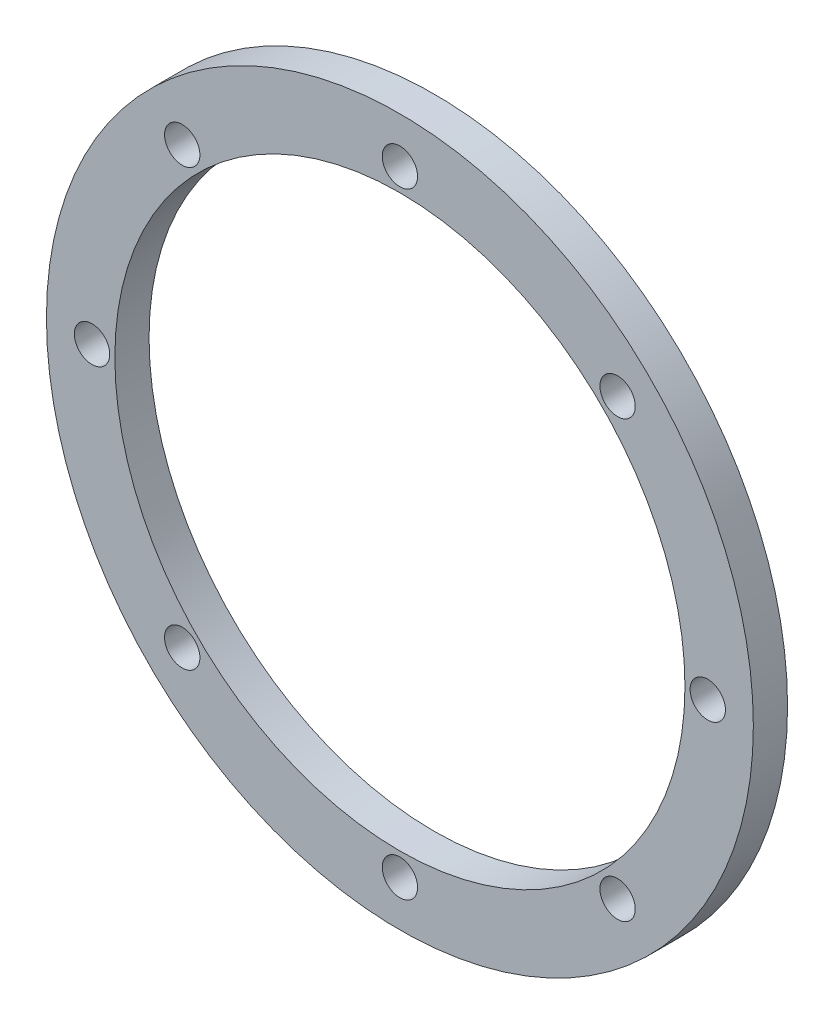
ISO-10303-21;
HEADER;
FILE_DESCRIPTION(('STEP AP214'),'2;1');
FILE_NAME('part.step','',(''),(''),'','','');
FILE_SCHEMA(('AUTOMOTIVE_DESIGN { 1 0 10303 214 1 1 1 1 }'));
ENDSEC;
DATA;
#1=APPLICATION_CONTEXT('core data for automotive mechanical design processes');
#2=APPLICATION_PROTOCOL_DEFINITION('international standard','automotive_design',2000,#1);
#3=PRODUCT_CONTEXT('',#1,'mechanical');
#4=PRODUCT('Part','Part','',(#3));
#5=PRODUCT_RELATED_PRODUCT_CATEGORY('part','',(#4));
#6=PRODUCT_DEFINITION_FORMATION('','',#4);
#7=PRODUCT_DEFINITION_CONTEXT('part definition',#1,'design');
#8=PRODUCT_DEFINITION('design','',#6,#7);
#9=PRODUCT_DEFINITION_SHAPE('','',#8);
#10=(LENGTH_UNIT() NAMED_UNIT(*) SI_UNIT(.MILLI.,.METRE.));
#11=(NAMED_UNIT(*) PLANE_ANGLE_UNIT() SI_UNIT($,.RADIAN.));
#12=(NAMED_UNIT(*) SI_UNIT($,.STERADIAN.) SOLID_ANGLE_UNIT());
#13=UNCERTAINTY_MEASURE_WITH_UNIT(LENGTH_MEASURE(1.E-05),#10,'distance_accuracy_value','');
#14=(GEOMETRIC_REPRESENTATION_CONTEXT(3) GLOBAL_UNCERTAINTY_ASSIGNED_CONTEXT((#13)) GLOBAL_UNIT_ASSIGNED_CONTEXT((#10,
#11,#12)) REPRESENTATION_CONTEXT('',''));
#15=CARTESIAN_POINT('',(0.,0.,0.));
#16=DIRECTION('',(0.,0.,1.));
#17=DIRECTION('',(1.,0.,0.));
#18=AXIS2_PLACEMENT_3D('',#15,#16,#17);
#19=CARTESIAN_POINT('',(0.,0.,3.));
#20=DIRECTION('',(0.,0.,1.));
#21=DIRECTION('',(1.,0.,0.));
#22=AXIS2_PLACEMENT_3D('',#19,#20,#21);
#23=PLANE('',#22);
#24=CARTESIAN_POINT('',(-2.82809988446294E-13,-27.,3.));
#25=DIRECTION('',(0.,0.,1.));
#26=DIRECTION('',(1.,0.,0.));
#27=AXIS2_PLACEMENT_3D('',#24,#25,#26);
#28=CIRCLE('',#27,1.55);
#29=CARTESIAN_POINT('',(1.54999999999971,-27.,3.));
#30=VERTEX_POINT('',#29);
#31=EDGE_CURVE('E86',#30,#30,#28,.T.);
#32=ORIENTED_EDGE('',*,*,#31,.F.);
#33=EDGE_LOOP('',(#32));
#34=FACE_BOUND('',#33,.T.);
#35=CARTESIAN_POINT('',(27.,-1.88539992297529E-13,3.));
#36=DIRECTION('',(0.,0.,1.));
#37=DIRECTION('',(1.,0.,0.));
#38=AXIS2_PLACEMENT_3D('',#35,#36,#37);
#39=CIRCLE('',#38,1.55);
#40=CARTESIAN_POINT('',(28.55,-1.88539992297529E-13,3.));
#41=VERTEX_POINT('',#40);
#42=EDGE_CURVE('E74',#41,#41,#39,.T.);
#43=ORIENTED_EDGE('',*,*,#42,.F.);
#44=EDGE_LOOP('',(#43));
#45=FACE_BOUND('',#44,.T.);
#46=CARTESIAN_POINT('',(0.,27.,3.));
#47=DIRECTION('',(0.,0.,1.));
#48=DIRECTION('',(1.,0.,0.));
#49=AXIS2_PLACEMENT_3D('',#46,#47,#48);
#50=CIRCLE('',#49,1.55);
#51=CARTESIAN_POINT('',(1.55000000000009,27.,3.));
#52=VERTEX_POINT('',#51);
#53=EDGE_CURVE('E62',#52,#52,#50,.T.);
#54=ORIENTED_EDGE('',*,*,#53,.F.);
#55=EDGE_LOOP('',(#54));
#56=FACE_BOUND('',#55,.T.);
#57=CARTESIAN_POINT('',(0.,0.,3.));
#58=DIRECTION('',(0.,0.,1.));
#59=DIRECTION('',(1.,0.,0.));
#60=AXIS2_PLACEMENT_3D('',#57,#58,#59);
#61=CIRCLE('',#60,25.);
#62=CARTESIAN_POINT('',(25.,0.,3.));
#63=VERTEX_POINT('',#62);
#64=EDGE_CURVE('E50',#63,#63,#61,.T.);
#65=ORIENTED_EDGE('',*,*,#64,.F.);
#66=EDGE_LOOP('',(#65));
#67=FACE_BOUND('',#66,.T.);
#68=CARTESIAN_POINT('',(0.,0.,3.));
#69=DIRECTION('',(0.,0.,1.));
#70=DIRECTION('',(1.,0.,0.));
#71=AXIS2_PLACEMENT_3D('',#68,#69,#70);
#72=CIRCLE('',#71,31.);
#73=CARTESIAN_POINT('',(31.,0.,3.));
#74=VERTEX_POINT('',#73);
#75=EDGE_CURVE('E10',#74,#74,#72,.T.);
#76=ORIENTED_EDGE('',*,*,#75,.T.);
#77=EDGE_LOOP('',(#76));
#78=FACE_BOUND('',#77,.T.);
#79=CARTESIAN_POINT('',(-27.,0.,3.));
#80=DIRECTION('',(0.,0.,1.));
#81=DIRECTION('',(1.,0.,0.));
#82=AXIS2_PLACEMENT_3D('',#79,#80,#81);
#83=CIRCLE('',#82,1.55);
#84=CARTESIAN_POINT('',(-25.45,0.,3.));
#85=VERTEX_POINT('',#84);
#86=EDGE_CURVE('E45',#85,#85,#83,.T.);
#87=ORIENTED_EDGE('',*,*,#86,.F.);
#88=EDGE_LOOP('',(#87));
#89=FACE_BOUND('',#88,.T.);
#90=CARTESIAN_POINT('',(-19.0918830920367,19.0918830920368,3.));
#91=DIRECTION('',(0.,0.,1.));
#92=DIRECTION('',(1.,0.,0.));
#93=AXIS2_PLACEMENT_3D('',#90,#91,#92);
#94=CIRCLE('',#93,1.54999999999999);
#95=CARTESIAN_POINT('',(-17.5418830920368,19.0918830920368,3.));
#96=VERTEX_POINT('',#95);
#97=EDGE_CURVE('E56',#96,#96,#94,.T.);
#98=ORIENTED_EDGE('',*,*,#97,.F.);
#99=EDGE_LOOP('',(#98));
#100=FACE_BOUND('',#99,.T.);
#101=CARTESIAN_POINT('',(19.0918830920369,19.0918830920367,3.));
#102=DIRECTION('',(0.,0.,1.));
#103=DIRECTION('',(1.,0.,0.));
#104=AXIS2_PLACEMENT_3D('',#101,#102,#103);
#105=CIRCLE('',#104,1.55);
#106=CARTESIAN_POINT('',(20.6418830920369,19.0918830920367,3.));
#107=VERTEX_POINT('',#106);
#108=EDGE_CURVE('E68',#107,#107,#105,.T.);
#109=ORIENTED_EDGE('',*,*,#108,.F.);
#110=EDGE_LOOP('',(#109));
#111=FACE_BOUND('',#110,.T.);
#112=CARTESIAN_POINT('',(19.0918830920366,-19.0918830920369,3.));
#113=DIRECTION('',(0.,0.,1.));
#114=DIRECTION('',(1.,0.,0.));
#115=AXIS2_PLACEMENT_3D('',#112,#113,#114);
#116=CIRCLE('',#115,1.54999999999999);
#117=CARTESIAN_POINT('',(20.6418830920366,-19.0918830920369,3.));
#118=VERTEX_POINT('',#117);
#119=EDGE_CURVE('E80',#118,#118,#116,.T.);
#120=ORIENTED_EDGE('',*,*,#119,.F.);
#121=EDGE_LOOP('',(#120));
#122=FACE_BOUND('',#121,.T.);
#123=CARTESIAN_POINT('',(-19.091883092037,-19.0918830920366,3.));
#124=DIRECTION('',(0.,0.,1.));
#125=DIRECTION('',(1.,0.,0.));
#126=AXIS2_PLACEMENT_3D('',#123,#124,#125);
#127=CIRCLE('',#126,1.55);
#128=CARTESIAN_POINT('',(-17.541883092037,-19.0918830920366,3.));
#129=VERTEX_POINT('',#128);
#130=EDGE_CURVE('E92',#129,#129,#127,.T.);
#131=ORIENTED_EDGE('',*,*,#130,.F.);
#132=EDGE_LOOP('',(#131));
#133=FACE_BOUND('',#132,.T.);
#134=ADVANCED_FACE('F34',(#34,#45,#56,#67,#78,#89,#100,#111,#122,#133),#23,.T.);
#135=CARTESIAN_POINT('',(0.,0.,0.));
#136=DIRECTION('',(0.,0.,1.));
#137=DIRECTION('',(1.,0.,0.));
#138=AXIS2_PLACEMENT_3D('',#135,#136,#137);
#139=PLANE('',#138);
#140=CARTESIAN_POINT('',(0.,0.,0.));
#141=DIRECTION('',(0.,0.,1.));
#142=DIRECTION('',(1.,0.,0.));
#143=AXIS2_PLACEMENT_3D('',#140,#141,#142);
#144=CIRCLE('',#143,31.);
#145=CARTESIAN_POINT('',(31.,0.,0.));
#146=VERTEX_POINT('',#145);
#147=EDGE_CURVE('E38',#146,#146,#144,.T.);
#148=ORIENTED_EDGE('',*,*,#147,.F.);
#149=EDGE_LOOP('',(#148));
#150=FACE_BOUND('',#149,.T.);
#151=CARTESIAN_POINT('',(-27.,0.,0.));
#152=DIRECTION('',(0.,0.,1.));
#153=DIRECTION('',(1.,0.,0.));
#154=AXIS2_PLACEMENT_3D('',#151,#152,#153);
#155=CIRCLE('',#154,1.55);
#156=CARTESIAN_POINT('',(-25.45,0.,0.));
#157=VERTEX_POINT('',#156);
#158=EDGE_CURVE('E47',#157,#157,#155,.T.);
#159=ORIENTED_EDGE('',*,*,#158,.T.);
#160=EDGE_LOOP('',(#159));
#161=FACE_BOUND('',#160,.T.);
#162=CARTESIAN_POINT('',(0.,0.,0.));
#163=DIRECTION('',(0.,0.,1.));
#164=DIRECTION('',(1.,0.,0.));
#165=AXIS2_PLACEMENT_3D('',#162,#163,#164);
#166=CIRCLE('',#165,25.);
#167=CARTESIAN_POINT('',(25.,0.,0.));
#168=VERTEX_POINT('',#167);
#169=EDGE_CURVE('E53',#168,#168,#166,.T.);
#170=ORIENTED_EDGE('',*,*,#169,.T.);
#171=EDGE_LOOP('',(#170));
#172=FACE_BOUND('',#171,.T.);
#173=CARTESIAN_POINT('',(-19.0918830920367,19.0918830920368,0.));
#174=DIRECTION('',(0.,0.,1.));
#175=DIRECTION('',(1.,0.,0.));
#176=AXIS2_PLACEMENT_3D('',#173,#174,#175);
#177=CIRCLE('',#176,1.54999999999999);
#178=CARTESIAN_POINT('',(-17.5418830920368,19.0918830920368,0.));
#179=VERTEX_POINT('',#178);
#180=EDGE_CURVE('E59',#179,#179,#177,.T.);
#181=ORIENTED_EDGE('',*,*,#180,.T.);
#182=EDGE_LOOP('',(#181));
#183=FACE_BOUND('',#182,.T.);
#184=CARTESIAN_POINT('',(0.,27.,0.));
#185=DIRECTION('',(0.,0.,1.));
#186=DIRECTION('',(1.,0.,0.));
#187=AXIS2_PLACEMENT_3D('',#184,#185,#186);
#188=CIRCLE('',#187,1.55);
#189=CARTESIAN_POINT('',(1.55000000000009,27.,0.));
#190=VERTEX_POINT('',#189);
#191=EDGE_CURVE('E65',#190,#190,#188,.T.);
#192=ORIENTED_EDGE('',*,*,#191,.T.);
#193=EDGE_LOOP('',(#192));
#194=FACE_BOUND('',#193,.T.);
#195=CARTESIAN_POINT('',(19.0918830920369,19.0918830920367,0.));
#196=DIRECTION('',(0.,0.,1.));
#197=DIRECTION('',(1.,0.,0.));
#198=AXIS2_PLACEMENT_3D('',#195,#196,#197);
#199=CIRCLE('',#198,1.55);
#200=CARTESIAN_POINT('',(20.6418830920369,19.0918830920367,0.));
#201=VERTEX_POINT('',#200);
#202=EDGE_CURVE('E71',#201,#201,#199,.T.);
#203=ORIENTED_EDGE('',*,*,#202,.T.);
#204=EDGE_LOOP('',(#203));
#205=FACE_BOUND('',#204,.T.);
#206=CARTESIAN_POINT('',(27.,-1.88539992297529E-13,0.));
#207=DIRECTION('',(0.,0.,1.));
#208=DIRECTION('',(1.,0.,0.));
#209=AXIS2_PLACEMENT_3D('',#206,#207,#208);
#210=CIRCLE('',#209,1.55);
#211=CARTESIAN_POINT('',(28.55,-1.88539992297529E-13,0.));
#212=VERTEX_POINT('',#211);
#213=EDGE_CURVE('E77',#212,#212,#210,.T.);
#214=ORIENTED_EDGE('',*,*,#213,.T.);
#215=EDGE_LOOP('',(#214));
#216=FACE_BOUND('',#215,.T.);
#217=CARTESIAN_POINT('',(19.0918830920366,-19.0918830920369,0.));
#218=DIRECTION('',(0.,0.,1.));
#219=DIRECTION('',(1.,0.,0.));
#220=AXIS2_PLACEMENT_3D('',#217,#218,#219);
#221=CIRCLE('',#220,1.54999999999999);
#222=CARTESIAN_POINT('',(20.6418830920366,-19.0918830920369,0.));
#223=VERTEX_POINT('',#222);
#224=EDGE_CURVE('E83',#223,#223,#221,.T.);
#225=ORIENTED_EDGE('',*,*,#224,.T.);
#226=EDGE_LOOP('',(#225));
#227=FACE_BOUND('',#226,.T.);
#228=CARTESIAN_POINT('',(-2.82809988446294E-13,-27.,0.));
#229=DIRECTION('',(0.,0.,1.));
#230=DIRECTION('',(1.,0.,0.));
#231=AXIS2_PLACEMENT_3D('',#228,#229,#230);
#232=CIRCLE('',#231,1.55);
#233=CARTESIAN_POINT('',(1.54999999999971,-27.,0.));
#234=VERTEX_POINT('',#233);
#235=EDGE_CURVE('E89',#234,#234,#232,.T.);
#236=ORIENTED_EDGE('',*,*,#235,.T.);
#237=EDGE_LOOP('',(#236));
#238=FACE_BOUND('',#237,.T.);
#239=CARTESIAN_POINT('',(-19.091883092037,-19.0918830920366,0.));
#240=DIRECTION('',(0.,0.,1.));
#241=DIRECTION('',(1.,0.,0.));
#242=AXIS2_PLACEMENT_3D('',#239,#240,#241);
#243=CIRCLE('',#242,1.55);
#244=CARTESIAN_POINT('',(-17.541883092037,-19.0918830920366,0.));
#245=VERTEX_POINT('',#244);
#246=EDGE_CURVE('E95',#245,#245,#243,.T.);
#247=ORIENTED_EDGE('',*,*,#246,.T.);
#248=EDGE_LOOP('',(#247));
#249=FACE_BOUND('',#248,.T.);
#250=ADVANCED_FACE('F105',(#150,#161,#172,#183,#194,#205,#216,#227,#238,#249),#139,.F.);
#251=CARTESIAN_POINT('',(0.,0.,3.));
#252=DIRECTION('',(0.,0.,-1.));
#253=DIRECTION('',(-1.,0.,0.));
#254=AXIS2_PLACEMENT_3D('',#251,#252,#253);
#255=CYLINDRICAL_SURFACE('',#254,31.);
#256=ORIENTED_EDGE('',*,*,#75,.F.);
#257=EDGE_LOOP('',(#256));
#258=FACE_BOUND('',#257,.T.);
#259=ORIENTED_EDGE('',*,*,#147,.T.);
#260=EDGE_LOOP('',(#259));
#261=FACE_BOUND('',#260,.T.);
#262=ADVANCED_FACE('F36',(#258,#261),#255,.T.);
#263=CARTESIAN_POINT('',(-27.,0.,3.));
#264=DIRECTION('',(0.,0.,-1.));
#265=DIRECTION('',(-1.,0.,0.));
#266=AXIS2_PLACEMENT_3D('',#263,#264,#265);
#267=CYLINDRICAL_SURFACE('',#266,1.55);
#268=ORIENTED_EDGE('',*,*,#86,.T.);
#269=EDGE_LOOP('',(#268));
#270=FACE_BOUND('',#269,.T.);
#271=ORIENTED_EDGE('',*,*,#158,.F.);
#272=EDGE_LOOP('',(#271));
#273=FACE_BOUND('',#272,.T.);
#274=ADVANCED_FACE('F115',(#270,#273),#267,.F.);
#275=CARTESIAN_POINT('',(0.,0.,3.));
#276=DIRECTION('',(0.,0.,-1.));
#277=DIRECTION('',(-1.,0.,0.));
#278=AXIS2_PLACEMENT_3D('',#275,#276,#277);
#279=CYLINDRICAL_SURFACE('',#278,25.);
#280=ORIENTED_EDGE('',*,*,#64,.T.);
#281=EDGE_LOOP('',(#280));
#282=FACE_BOUND('',#281,.T.);
#283=ORIENTED_EDGE('',*,*,#169,.F.);
#284=EDGE_LOOP('',(#283));
#285=FACE_BOUND('',#284,.T.);
#286=ADVANCED_FACE('F118',(#282,#285),#279,.F.);
#287=CARTESIAN_POINT('',(-19.0918830920367,19.0918830920368,3.));
#288=DIRECTION('',(0.,0.,-1.));
#289=DIRECTION('',(-1.,0.,0.));
#290=AXIS2_PLACEMENT_3D('',#287,#288,#289);
#291=CYLINDRICAL_SURFACE('',#290,1.54999999999999);
#292=ORIENTED_EDGE('',*,*,#97,.T.);
#293=EDGE_LOOP('',(#292));
#294=FACE_BOUND('',#293,.T.);
#295=ORIENTED_EDGE('',*,*,#180,.F.);
#296=EDGE_LOOP('',(#295));
#297=FACE_BOUND('',#296,.T.);
#298=ADVANCED_FACE('F122',(#294,#297),#291,.F.);
#299=CARTESIAN_POINT('',(0.,27.,3.));
#300=DIRECTION('',(0.,0.,-1.));
#301=DIRECTION('',(-1.,0.,0.));
#302=AXIS2_PLACEMENT_3D('',#299,#300,#301);
#303=CYLINDRICAL_SURFACE('',#302,1.55);
#304=ORIENTED_EDGE('',*,*,#53,.T.);
#305=EDGE_LOOP('',(#304));
#306=FACE_BOUND('',#305,.T.);
#307=ORIENTED_EDGE('',*,*,#191,.F.);
#308=EDGE_LOOP('',(#307));
#309=FACE_BOUND('',#308,.T.);
#310=ADVANCED_FACE('F126',(#306,#309),#303,.F.);
#311=CARTESIAN_POINT('',(19.0918830920369,19.0918830920367,3.));
#312=DIRECTION('',(0.,0.,-1.));
#313=DIRECTION('',(-1.,0.,0.));
#314=AXIS2_PLACEMENT_3D('',#311,#312,#313);
#315=CYLINDRICAL_SURFACE('',#314,1.55);
#316=ORIENTED_EDGE('',*,*,#108,.T.);
#317=EDGE_LOOP('',(#316));
#318=FACE_BOUND('',#317,.T.);
#319=ORIENTED_EDGE('',*,*,#202,.F.);
#320=EDGE_LOOP('',(#319));
#321=FACE_BOUND('',#320,.T.);
#322=ADVANCED_FACE('F130',(#318,#321),#315,.F.);
#323=CARTESIAN_POINT('',(27.,-1.88539992297529E-13,3.));
#324=DIRECTION('',(0.,0.,-1.));
#325=DIRECTION('',(-1.,0.,0.));
#326=AXIS2_PLACEMENT_3D('',#323,#324,#325);
#327=CYLINDRICAL_SURFACE('',#326,1.55);
#328=ORIENTED_EDGE('',*,*,#42,.T.);
#329=EDGE_LOOP('',(#328));
#330=FACE_BOUND('',#329,.T.);
#331=ORIENTED_EDGE('',*,*,#213,.F.);
#332=EDGE_LOOP('',(#331));
#333=FACE_BOUND('',#332,.T.);
#334=ADVANCED_FACE('F134',(#330,#333),#327,.F.);
#335=CARTESIAN_POINT('',(19.0918830920366,-19.0918830920369,3.));
#336=DIRECTION('',(0.,0.,-1.));
#337=DIRECTION('',(-1.,0.,0.));
#338=AXIS2_PLACEMENT_3D('',#335,#336,#337);
#339=CYLINDRICAL_SURFACE('',#338,1.54999999999999);
#340=ORIENTED_EDGE('',*,*,#119,.T.);
#341=EDGE_LOOP('',(#340));
#342=FACE_BOUND('',#341,.T.);
#343=ORIENTED_EDGE('',*,*,#224,.F.);
#344=EDGE_LOOP('',(#343));
#345=FACE_BOUND('',#344,.T.);
#346=ADVANCED_FACE('F138',(#342,#345),#339,.F.);
#347=CARTESIAN_POINT('',(-2.82809988446294E-13,-27.,3.));
#348=DIRECTION('',(0.,0.,-1.));
#349=DIRECTION('',(-1.,0.,0.));
#350=AXIS2_PLACEMENT_3D('',#347,#348,#349);
#351=CYLINDRICAL_SURFACE('',#350,1.55);
#352=ORIENTED_EDGE('',*,*,#31,.T.);
#353=EDGE_LOOP('',(#352));
#354=FACE_BOUND('',#353,.T.);
#355=ORIENTED_EDGE('',*,*,#235,.F.);
#356=EDGE_LOOP('',(#355));
#357=FACE_BOUND('',#356,.T.);
#358=ADVANCED_FACE('F142',(#354,#357),#351,.F.);
#359=CARTESIAN_POINT('',(-19.091883092037,-19.0918830920366,3.));
#360=DIRECTION('',(0.,0.,-1.));
#361=DIRECTION('',(-1.,0.,0.));
#362=AXIS2_PLACEMENT_3D('',#359,#360,#361);
#363=CYLINDRICAL_SURFACE('',#362,1.55);
#364=ORIENTED_EDGE('',*,*,#130,.T.);
#365=EDGE_LOOP('',(#364));
#366=FACE_BOUND('',#365,.T.);
#367=ORIENTED_EDGE('',*,*,#246,.F.);
#368=EDGE_LOOP('',(#367));
#369=FACE_BOUND('',#368,.T.);
#370=ADVANCED_FACE('F101',(#366,#369),#363,.F.);
#371=CLOSED_SHELL('',(#134,#250,#262,#274,#286,#298,#310,#322,#334,#346,#358,#370));
#372=MANIFOLD_SOLID_BREP('B2',#371);
#373=ADVANCED_BREP_SHAPE_REPRESENTATION('',(#18,#372),#14);
#374=SHAPE_DEFINITION_REPRESENTATION(#9,#373);
ENDSEC;
END-ISO-10303-21;
